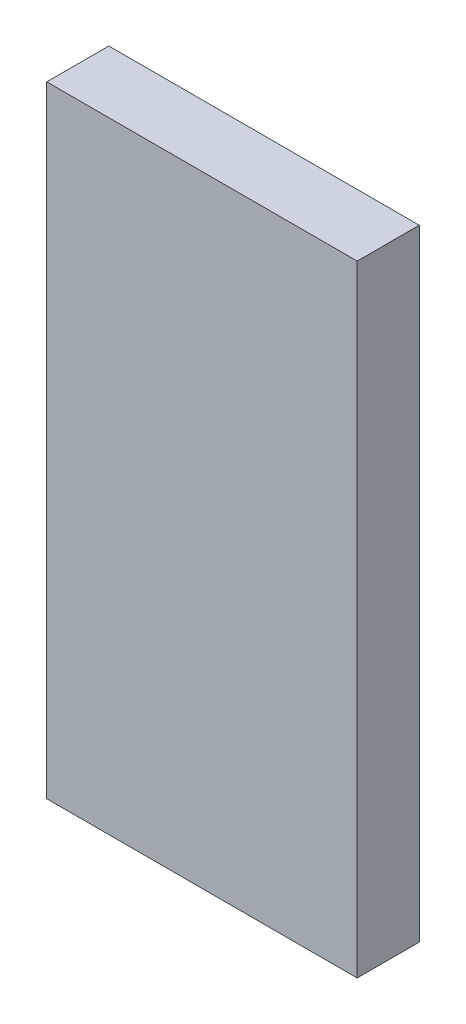
ISO-10303-21;
HEADER;
FILE_DESCRIPTION(('STEP AP214'),'2;1');
FILE_NAME('part.step','',(''),(''),'','','');
FILE_SCHEMA(('AUTOMOTIVE_DESIGN { 1 0 10303 214 1 1 1 1 }'));
ENDSEC;
DATA;
#1=APPLICATION_CONTEXT('core data for automotive mechanical design processes');
#2=APPLICATION_PROTOCOL_DEFINITION('international standard','automotive_design',2000,#1);
#3=PRODUCT_CONTEXT('',#1,'mechanical');
#4=PRODUCT('Part','Part','',(#3));
#5=PRODUCT_RELATED_PRODUCT_CATEGORY('part','',(#4));
#6=PRODUCT_DEFINITION_FORMATION('','',#4);
#7=PRODUCT_DEFINITION_CONTEXT('part definition',#1,'design');
#8=PRODUCT_DEFINITION('design','',#6,#7);
#9=PRODUCT_DEFINITION_SHAPE('','',#8);
#10=(LENGTH_UNIT() NAMED_UNIT(*) SI_UNIT(.MILLI.,.METRE.));
#11=(NAMED_UNIT(*) PLANE_ANGLE_UNIT() SI_UNIT($,.RADIAN.));
#12=(NAMED_UNIT(*) SI_UNIT($,.STERADIAN.) SOLID_ANGLE_UNIT());
#13=UNCERTAINTY_MEASURE_WITH_UNIT(LENGTH_MEASURE(1.E-05),#10,'distance_accuracy_value','');
#14=(GEOMETRIC_REPRESENTATION_CONTEXT(3) GLOBAL_UNCERTAINTY_ASSIGNED_CONTEXT((#13)) GLOBAL_UNIT_ASSIGNED_CONTEXT((#10,
#11,#12)) REPRESENTATION_CONTEXT('',''));
#15=CARTESIAN_POINT('',(0.,0.,0.));
#16=DIRECTION('',(0.,0.,1.));
#17=DIRECTION('',(1.,0.,0.));
#18=AXIS2_PLACEMENT_3D('',#15,#16,#17);
#19=CARTESIAN_POINT('',(0.,0.,0.));
#20=DIRECTION('',(0.,0.,1.));
#21=DIRECTION('',(1.,0.,0.));
#22=AXIS2_PLACEMENT_3D('',#19,#20,#21);
#23=PLANE('',#22);
#24=DIRECTION('',(0.,-1.,0.));
#25=VECTOR('',#24,1.);
#26=CARTESIAN_POINT('',(-103.022771180261,45.3184417448885,0.));
#27=LINE('',#26,#25);
#28=CARTESIAN_POINT('',(-103.022771180261,45.3184417448885,0.));
#29=VERTEX_POINT('',#28);
#30=CARTESIAN_POINT('',(-103.022771180261,-34.6815582551115,0.));
#31=VERTEX_POINT('',#30);
#32=EDGE_CURVE('E278',#29,#31,#27,.T.);
#33=ORIENTED_EDGE('',*,*,#32,.F.);
#34=DIRECTION('',(1.,0.,0.));
#35=VECTOR('',#34,1.);
#36=CARTESIAN_POINT('',(-103.022771180261,45.3184417448885,0.));
#37=LINE('',#36,#35);
#38=CARTESIAN_POINT('',(-63.022771180261,45.3184417448885,0.));
#39=VERTEX_POINT('',#38);
#40=EDGE_CURVE('E284',#29,#39,#37,.T.);
#41=ORIENTED_EDGE('',*,*,#40,.T.);
#42=DIRECTION('',(0.,-1.,0.));
#43=VECTOR('',#42,1.);
#44=CARTESIAN_POINT('',(-63.022771180261,45.3184417448885,0.));
#45=LINE('',#44,#43);
#46=CARTESIAN_POINT('',(-63.022771180261,-34.6815582551115,0.));
#47=VERTEX_POINT('',#46);
#48=EDGE_CURVE('E303',#39,#47,#45,.T.);
#49=ORIENTED_EDGE('',*,*,#48,.T.);
#50=DIRECTION('',(1.,0.,0.));
#51=VECTOR('',#50,1.);
#52=CARTESIAN_POINT('',(-103.022771180261,-34.6815582551115,0.));
#53=LINE('',#52,#51);
#54=EDGE_CURVE('E299',#31,#47,#53,.T.);
#55=ORIENTED_EDGE('',*,*,#54,.F.);
#56=EDGE_LOOP('',(#33,#41,#49,#55));
#57=FACE_BOUND('',#56,.T.);
#58=DIRECTION('',(0.707106781186549,-0.707106781186546,0.));
#59=VECTOR('',#58,1.);
#60=CARTESIAN_POINT('',(-94.8912840094374,34.6824027755674,0.));
#61=LINE('',#60,#59);
#62=CARTESIAN_POINT('',(-94.8912840094374,34.6824027755674,0.));
#63=VERTEX_POINT('',#62);
#64=CARTESIAN_POINT('',(-68.8912840094374,8.68240277556752,0.));
#65=VERTEX_POINT('',#64);
#66=EDGE_CURVE('E186',#63,#65,#61,.T.);
#67=ORIENTED_EDGE('',*,*,#66,.F.);
#68=DIRECTION('',(-0.707106781186546,-0.707106781186549,0.));
#69=VECTOR('',#68,1.);
#70=CARTESIAN_POINT('',(-94.8912840094374,34.6824027755674,0.));
#71=LINE('',#70,#69);
#72=CARTESIAN_POINT('',(-97.012604352997,32.5610824320078,0.));
#73=VERTEX_POINT('',#72);
#74=EDGE_CURVE('E167',#63,#73,#71,.T.);
#75=ORIENTED_EDGE('',*,*,#74,.T.);
#76=DIRECTION('',(0.,-1.,0.));
#77=VECTOR('',#76,1.);
#78=CARTESIAN_POINT('',(-97.012604352997,25.3184417448885,0.));
#79=LINE('',#78,#77);
#80=CARTESIAN_POINT('',(-97.012604352997,-17.6815582551115,0.));
#81=VERTEX_POINT('',#80);
#82=EDGE_CURVE('E252',#73,#81,#79,.T.);
#83=ORIENTED_EDGE('',*,*,#82,.T.);
#84=DIRECTION('',(1.,0.,0.));
#85=VECTOR('',#84,1.);
#86=CARTESIAN_POINT('',(-94.012604352997,-17.6815582551115,0.));
#87=LINE('',#86,#85);
#88=CARTESIAN_POINT('',(-71.012604352997,-17.6815582551115,0.));
#89=VERTEX_POINT('',#88);
#90=EDGE_CURVE('E79',#81,#89,#87,.T.);
#91=ORIENTED_EDGE('',*,*,#90,.T.);
#92=DIRECTION('',(0.,1.,0.));
#93=VECTOR('',#92,1.);
#94=CARTESIAN_POINT('',(-71.012604352997,-14.6815582551115,0.));
#95=LINE('',#94,#93);
#96=CARTESIAN_POINT('',(-71.012604352997,6.56108243200788,0.));
#97=VERTEX_POINT('',#96);
#98=EDGE_CURVE('E262',#89,#97,#95,.T.);
#99=ORIENTED_EDGE('',*,*,#98,.T.);
#100=DIRECTION('',(-0.707106781186546,-0.707106781186549,0.));
#101=VECTOR('',#100,1.);
#102=CARTESIAN_POINT('',(-68.8912840094374,8.68240277556752,0.));
#103=LINE('',#102,#101);
#104=EDGE_CURVE('E179',#65,#97,#103,.T.);
#105=ORIENTED_EDGE('',*,*,#104,.F.);
#106=EDGE_LOOP('',(#67,#75,#83,#91,#99,#105));
#107=FACE_BOUND('',#106,.T.);
#108=ADVANCED_FACE('F63',(#57,#107),#23,.F.);
#109=CARTESIAN_POINT('',(-103.022771180261,45.3184417448885,8.));
#110=DIRECTION('',(1.,0.,0.));
#111=DIRECTION('',(0.,1.,0.));
#112=AXIS2_PLACEMENT_3D('',#109,#110,#111);
#113=PLANE('',#112);
#114=ORIENTED_EDGE('',*,*,#32,.T.);
#115=DIRECTION('',(0.,0.,-1.));
#116=VECTOR('',#115,1.);
#117=CARTESIAN_POINT('',(-103.022771180261,-34.6815582551115,8.));
#118=LINE('',#117,#116);
#119=CARTESIAN_POINT('',(-103.022771180261,-34.6815582551115,8.));
#120=VERTEX_POINT('',#119);
#121=EDGE_CURVE('E12',#120,#31,#118,.T.);
#122=ORIENTED_EDGE('',*,*,#121,.F.);
#123=DIRECTION('',(0.,-1.,0.));
#124=VECTOR('',#123,1.);
#125=CARTESIAN_POINT('',(-103.022771180261,45.3184417448885,8.));
#126=LINE('',#125,#124);
#127=CARTESIAN_POINT('',(-103.022771180261,45.3184417448885,8.));
#128=VERTEX_POINT('',#127);
#129=EDGE_CURVE('E279',#128,#120,#126,.T.);
#130=ORIENTED_EDGE('',*,*,#129,.F.);
#131=DIRECTION('',(0.,0.,-1.));
#132=VECTOR('',#131,1.);
#133=CARTESIAN_POINT('',(-103.022771180261,45.3184417448885,8.));
#134=LINE('',#133,#132);
#135=EDGE_CURVE('E295',#128,#29,#134,.T.);
#136=ORIENTED_EDGE('',*,*,#135,.T.);
#137=EDGE_LOOP('',(#114,#122,#130,#136));
#138=FACE_BOUND('',#137,.T.);
#139=ADVANCED_FACE('F65',(#138),#113,.F.);
#140=CARTESIAN_POINT('',(-103.022771180261,-34.6815582551115,8.));
#141=DIRECTION('',(0.,1.,0.));
#142=DIRECTION('',(-1.,0.,0.));
#143=AXIS2_PLACEMENT_3D('',#140,#141,#142);
#144=PLANE('',#143);
#145=ORIENTED_EDGE('',*,*,#54,.T.);
#146=DIRECTION('',(0.,0.,-1.));
#147=VECTOR('',#146,1.);
#148=CARTESIAN_POINT('',(-63.022771180261,-34.6815582551115,8.));
#149=LINE('',#148,#147);
#150=CARTESIAN_POINT('',(-63.022771180261,-34.6815582551115,8.));
#151=VERTEX_POINT('',#150);
#152=EDGE_CURVE('E72',#151,#47,#149,.T.);
#153=ORIENTED_EDGE('',*,*,#152,.F.);
#154=DIRECTION('',(1.,0.,0.));
#155=VECTOR('',#154,1.);
#156=CARTESIAN_POINT('',(-103.022771180261,-34.6815582551115,8.));
#157=LINE('',#156,#155);
#158=EDGE_CURVE('E283',#120,#151,#157,.T.);
#159=ORIENTED_EDGE('',*,*,#158,.F.);
#160=ORIENTED_EDGE('',*,*,#121,.T.);
#161=EDGE_LOOP('',(#145,#153,#159,#160));
#162=FACE_BOUND('',#161,.T.);
#163=ADVANCED_FACE('F321',(#162),#144,.F.);
#164=CARTESIAN_POINT('',(-63.022771180261,45.3184417448885,8.));
#165=DIRECTION('',(1.,0.,0.));
#166=DIRECTION('',(0.,1.,0.));
#167=AXIS2_PLACEMENT_3D('',#164,#165,#166);
#168=PLANE('',#167);
#169=ORIENTED_EDGE('',*,*,#48,.F.);
#170=DIRECTION('',(0.,0.,-1.));
#171=VECTOR('',#170,1.);
#172=CARTESIAN_POINT('',(-63.022771180261,45.3184417448885,8.));
#173=LINE('',#172,#171);
#174=CARTESIAN_POINT('',(-63.022771180261,45.3184417448885,8.));
#175=VERTEX_POINT('',#174);
#176=EDGE_CURVE('E312',#175,#39,#173,.T.);
#177=ORIENTED_EDGE('',*,*,#176,.F.);
#178=DIRECTION('',(0.,-1.,0.));
#179=VECTOR('',#178,1.);
#180=CARTESIAN_POINT('',(-63.022771180261,45.3184417448885,8.));
#181=LINE('',#180,#179);
#182=EDGE_CURVE('E287',#175,#151,#181,.T.);
#183=ORIENTED_EDGE('',*,*,#182,.T.);
#184=ORIENTED_EDGE('',*,*,#152,.T.);
#185=EDGE_LOOP('',(#169,#177,#183,#184));
#186=FACE_BOUND('',#185,.T.);
#187=ADVANCED_FACE('F318',(#186),#168,.T.);
#188=CARTESIAN_POINT('',(-103.022771180261,45.3184417448885,8.));
#189=DIRECTION('',(0.,1.,0.));
#190=DIRECTION('',(0.,0.,1.));
#191=AXIS2_PLACEMENT_3D('',#188,#189,#190);
#192=PLANE('',#191);
#193=ORIENTED_EDGE('',*,*,#40,.F.);
#194=ORIENTED_EDGE('',*,*,#135,.F.);
#195=DIRECTION('',(1.,0.,0.));
#196=VECTOR('',#195,1.);
#197=CARTESIAN_POINT('',(-103.022771180261,45.3184417448885,8.));
#198=LINE('',#197,#196);
#199=EDGE_CURVE('E291',#128,#175,#198,.T.);
#200=ORIENTED_EDGE('',*,*,#199,.T.);
#201=ORIENTED_EDGE('',*,*,#176,.T.);
#202=EDGE_LOOP('',(#193,#194,#200,#201));
#203=FACE_BOUND('',#202,.T.);
#204=ADVANCED_FACE('F327',(#203),#192,.T.);
#205=CARTESIAN_POINT('',(0.,0.,8.));
#206=DIRECTION('',(0.,0.,1.));
#207=DIRECTION('',(1.,0.,0.));
#208=AXIS2_PLACEMENT_3D('',#205,#206,#207);
#209=PLANE('',#208);
#210=ORIENTED_EDGE('',*,*,#129,.T.);
#211=ORIENTED_EDGE('',*,*,#158,.T.);
#212=ORIENTED_EDGE('',*,*,#182,.F.);
#213=ORIENTED_EDGE('',*,*,#199,.F.);
#214=EDGE_LOOP('',(#210,#211,#212,#213));
#215=FACE_BOUND('',#214,.T.);
#216=ADVANCED_FACE('F331',(#215),#209,.T.);
#217=CARTESIAN_POINT('',(0.,0.,6.));
#218=DIRECTION('',(0.,0.,1.));
#219=DIRECTION('',(1.,0.,0.));
#220=AXIS2_PLACEMENT_3D('',#217,#218,#219);
#221=PLANE('',#220);
#222=DIRECTION('',(1.,0.,0.));
#223=VECTOR('',#222,1.);
#224=CARTESIAN_POINT('',(-94.012604352997,-17.6815582551115,6.));
#225=LINE('',#224,#223);
#226=CARTESIAN_POINT('',(-97.012604352997,-17.6815582551115,6.));
#227=VERTEX_POINT('',#226);
#228=CARTESIAN_POINT('',(-71.012604352997,-17.6815582551115,6.));
#229=VERTEX_POINT('',#228);
#230=EDGE_CURVE('E247',#227,#229,#225,.T.);
#231=ORIENTED_EDGE('',*,*,#230,.F.);
#232=DIRECTION('',(0.,-1.,0.));
#233=VECTOR('',#232,1.);
#234=CARTESIAN_POINT('',(-97.012604352997,25.3184417448885,6.));
#235=LINE('',#234,#233);
#236=CARTESIAN_POINT('',(-97.012604352997,32.5610824320078,6.));
#237=VERTEX_POINT('',#236);
#238=EDGE_CURVE('E256',#237,#227,#235,.T.);
#239=ORIENTED_EDGE('',*,*,#238,.F.);
#240=DIRECTION('',(-0.707106781186546,-0.707106781186549,0.));
#241=VECTOR('',#240,1.);
#242=CARTESIAN_POINT('',(-94.8912840094374,34.6824027755674,6.));
#243=LINE('',#242,#241);
#244=CARTESIAN_POINT('',(-94.8912840094374,34.6824027755674,6.));
#245=VERTEX_POINT('',#244);
#246=EDGE_CURVE('E200',#245,#237,#243,.T.);
#247=ORIENTED_EDGE('',*,*,#246,.F.);
#248=DIRECTION('',(-0.707106781186549,0.707106781186546,0.));
#249=VECTOR('',#248,1.);
#250=CARTESIAN_POINT('',(-68.8912840094374,8.68240277556752,6.));
#251=LINE('',#250,#249);
#252=CARTESIAN_POINT('',(-68.8912840094374,8.68240277556752,6.));
#253=VERTEX_POINT('',#252);
#254=EDGE_CURVE('E180',#253,#245,#251,.T.);
#255=ORIENTED_EDGE('',*,*,#254,.F.);
#256=DIRECTION('',(-0.707106781186546,-0.707106781186549,0.));
#257=VECTOR('',#256,1.);
#258=CARTESIAN_POINT('',(-68.8912840094374,8.68240277556752,6.));
#259=LINE('',#258,#257);
#260=CARTESIAN_POINT('',(-71.012604352997,6.56108243200788,6.));
#261=VERTEX_POINT('',#260);
#262=EDGE_CURVE('E204',#253,#261,#259,.T.);
#263=ORIENTED_EDGE('',*,*,#262,.T.);
#264=DIRECTION('',(0.,1.,0.));
#265=VECTOR('',#264,1.);
#266=CARTESIAN_POINT('',(-71.012604352997,-14.6815582551115,6.));
#267=LINE('',#266,#265);
#268=EDGE_CURVE('E251',#229,#261,#267,.T.);
#269=ORIENTED_EDGE('',*,*,#268,.F.);
#270=EDGE_LOOP('',(#231,#239,#247,#255,#263,#269));
#271=FACE_BOUND('',#270,.T.);
#272=DIRECTION('',(0.,1.,0.));
#273=VECTOR('',#272,1.);
#274=CARTESIAN_POINT('',(-77.012604352997,-14.6815582551115,6.));
#275=LINE('',#274,#273);
#276=CARTESIAN_POINT('',(-77.012604352997,-11.6815582551115,6.));
#277=VERTEX_POINT('',#276);
#278=CARTESIAN_POINT('',(-77.012604352997,4.07580105776931,6.));
#279=VERTEX_POINT('',#278);
#280=EDGE_CURVE('E212',#277,#279,#275,.T.);
#281=ORIENTED_EDGE('',*,*,#280,.T.);
#282=DIRECTION('',(-0.707106781186549,0.707106781186546,0.));
#283=VECTOR('',#282,1.);
#284=CARTESIAN_POINT('',(-76.1339246965566,3.19712140132895,6.));
#285=LINE('',#284,#283);
#286=CARTESIAN_POINT('',(-91.012604352997,18.0758010577692,6.));
#287=VERTEX_POINT('',#286);
#288=EDGE_CURVE('E216',#279,#287,#285,.T.);
#289=ORIENTED_EDGE('',*,*,#288,.T.);
#290=DIRECTION('',(0.,-1.,0.));
#291=VECTOR('',#290,1.);
#292=CARTESIAN_POINT('',(-91.012604352997,25.3184417448885,6.));
#293=LINE('',#292,#291);
#294=CARTESIAN_POINT('',(-91.012604352997,-11.6815582551115,6.));
#295=VERTEX_POINT('',#294);
#296=EDGE_CURVE('E220',#287,#295,#293,.T.);
#297=ORIENTED_EDGE('',*,*,#296,.T.);
#298=DIRECTION('',(1.,0.,0.));
#299=VECTOR('',#298,1.);
#300=CARTESIAN_POINT('',(-94.012604352997,-11.6815582551115,6.));
#301=LINE('',#300,#299);
#302=EDGE_CURVE('E209',#295,#277,#301,.T.);
#303=ORIENTED_EDGE('',*,*,#302,.T.);
#304=EDGE_LOOP('',(#281,#289,#297,#303));
#305=FACE_BOUND('',#304,.T.);
#306=ADVANCED_FACE('F371',(#271,#305),#221,.F.);
#307=CARTESIAN_POINT('',(-94.012604352997,-17.6815582551115,6.));
#308=DIRECTION('',(0.,1.,0.));
#309=DIRECTION('',(0.,0.,1.));
#310=AXIS2_PLACEMENT_3D('',#307,#308,#309);
#311=PLANE('',#310);
#312=ORIENTED_EDGE('',*,*,#90,.F.);
#313=DIRECTION('',(0.,0.,-1.));
#314=VECTOR('',#313,1.);
#315=CARTESIAN_POINT('',(-97.012604352997,-17.6815582551115,6.));
#316=LINE('',#315,#314);
#317=EDGE_CURVE('E259',#227,#81,#316,.T.);
#318=ORIENTED_EDGE('',*,*,#317,.F.);
#319=ORIENTED_EDGE('',*,*,#230,.T.);
#320=DIRECTION('',(0.,0.,-1.));
#321=VECTOR('',#320,1.);
#322=CARTESIAN_POINT('',(-71.012604352997,-17.6815582551115,6.));
#323=LINE('',#322,#321);
#324=EDGE_CURVE('E275',#229,#89,#323,.T.);
#325=ORIENTED_EDGE('',*,*,#324,.T.);
#326=EDGE_LOOP('',(#312,#318,#319,#325));
#327=FACE_BOUND('',#326,.T.);
#328=ADVANCED_FACE('F373',(#327),#311,.T.);
#329=CARTESIAN_POINT('',(-71.012604352997,-14.6815582551115,6.));
#330=DIRECTION('',(-1.,0.,0.));
#331=DIRECTION('',(0.,0.,1.));
#332=AXIS2_PLACEMENT_3D('',#329,#330,#331);
#333=PLANE('',#332);
#334=ORIENTED_EDGE('',*,*,#98,.F.);
#335=ORIENTED_EDGE('',*,*,#324,.F.);
#336=ORIENTED_EDGE('',*,*,#268,.T.);
#337=DIRECTION('',(0.,0.,-1.));
#338=VECTOR('',#337,1.);
#339=CARTESIAN_POINT('',(-71.012604352997,6.56108243200788,6.));
#340=LINE('',#339,#338);
#341=EDGE_CURVE('E271',#261,#97,#340,.T.);
#342=ORIENTED_EDGE('',*,*,#341,.T.);
#343=EDGE_LOOP('',(#334,#335,#336,#342));
#344=FACE_BOUND('',#343,.T.);
#345=ADVANCED_FACE('F380',(#344),#333,.T.);
#346=CARTESIAN_POINT('',(-97.012604352997,25.3184417448885,6.));
#347=DIRECTION('',(1.,0.,0.));
#348=DIRECTION('',(0.,0.,-1.));
#349=AXIS2_PLACEMENT_3D('',#346,#347,#348);
#350=PLANE('',#349);
#351=ORIENTED_EDGE('',*,*,#82,.F.);
#352=DIRECTION('',(0.,0.,-1.));
#353=VECTOR('',#352,1.);
#354=CARTESIAN_POINT('',(-97.012604352997,32.5610824320078,6.));
#355=LINE('',#354,#353);
#356=EDGE_CURVE('E173',#237,#73,#355,.T.);
#357=ORIENTED_EDGE('',*,*,#356,.F.);
#358=ORIENTED_EDGE('',*,*,#238,.T.);
#359=ORIENTED_EDGE('',*,*,#317,.T.);
#360=EDGE_LOOP('',(#351,#357,#358,#359));
#361=FACE_BOUND('',#360,.T.);
#362=ADVANCED_FACE('F386',(#361),#350,.T.);
#363=CARTESIAN_POINT('',(-94.012604352997,-11.6815582551115,6.));
#364=DIRECTION('',(0.,1.,0.));
#365=DIRECTION('',(0.,0.,1.));
#366=AXIS2_PLACEMENT_3D('',#363,#364,#365);
#367=PLANE('',#366);
#368=DIRECTION('',(1.,0.,0.));
#369=VECTOR('',#368,1.);
#370=CARTESIAN_POINT('',(-94.012604352997,-11.6815582551115,0.));
#371=LINE('',#370,#369);
#372=CARTESIAN_POINT('',(-91.012604352997,-11.6815582551115,0.));
#373=VERTEX_POINT('',#372);
#374=CARTESIAN_POINT('',(-77.012604352997,-11.6815582551115,0.));
#375=VERTEX_POINT('',#374);
#376=EDGE_CURVE('E203',#373,#375,#371,.T.);
#377=ORIENTED_EDGE('',*,*,#376,.T.);
#378=DIRECTION('',(0.,0.,-1.));
#379=VECTOR('',#378,1.);
#380=CARTESIAN_POINT('',(-77.012604352997,-11.6815582551115,6.));
#381=LINE('',#380,#379);
#382=EDGE_CURVE('E244',#277,#375,#381,.T.);
#383=ORIENTED_EDGE('',*,*,#382,.F.);
#384=ORIENTED_EDGE('',*,*,#302,.F.);
#385=DIRECTION('',(0.,0.,-1.));
#386=VECTOR('',#385,1.);
#387=CARTESIAN_POINT('',(-91.012604352997,-11.6815582551115,6.));
#388=LINE('',#387,#386);
#389=EDGE_CURVE('E223',#295,#373,#388,.T.);
#390=ORIENTED_EDGE('',*,*,#389,.T.);
#391=EDGE_LOOP('',(#377,#383,#384,#390));
#392=FACE_BOUND('',#391,.T.);
#393=ADVANCED_FACE('F367',(#392),#367,.F.);
#394=CARTESIAN_POINT('',(-77.012604352997,-14.6815582551115,6.));
#395=DIRECTION('',(-1.,0.,0.));
#396=DIRECTION('',(0.,0.,1.));
#397=AXIS2_PLACEMENT_3D('',#394,#395,#396);
#398=PLANE('',#397);
#399=DIRECTION('',(0.,1.,0.));
#400=VECTOR('',#399,1.);
#401=CARTESIAN_POINT('',(-77.012604352997,-14.6815582551115,0.));
#402=LINE('',#401,#400);
#403=CARTESIAN_POINT('',(-77.012604352997,4.07580105776931,0.));
#404=VERTEX_POINT('',#403);
#405=EDGE_CURVE('E227',#375,#404,#402,.T.);
#406=ORIENTED_EDGE('',*,*,#405,.T.);
#407=DIRECTION('',(0.,0.,-1.));
#408=VECTOR('',#407,1.);
#409=CARTESIAN_POINT('',(-77.012604352997,4.07580105776931,6.));
#410=LINE('',#409,#408);
#411=EDGE_CURVE('E241',#279,#404,#410,.T.);
#412=ORIENTED_EDGE('',*,*,#411,.F.);
#413=ORIENTED_EDGE('',*,*,#280,.F.);
#414=ORIENTED_EDGE('',*,*,#382,.T.);
#415=EDGE_LOOP('',(#406,#412,#413,#414));
#416=FACE_BOUND('',#415,.T.);
#417=ADVANCED_FACE('F361',(#416),#398,.F.);
#418=CARTESIAN_POINT('',(-76.1339246965566,3.19712140132895,6.));
#419=DIRECTION('',(-0.707106781186546,-0.707106781186549,0.));
#420=DIRECTION('',(0.707106781186549,-0.707106781186546,0.));
#421=AXIS2_PLACEMENT_3D('',#418,#419,#420);
#422=PLANE('',#421);
#423=DIRECTION('',(-0.707106781186549,0.707106781186546,0.));
#424=VECTOR('',#423,1.);
#425=CARTESIAN_POINT('',(-76.1339246965566,3.19712140132895,0.));
#426=LINE('',#425,#424);
#427=CARTESIAN_POINT('',(-91.012604352997,18.0758010577692,0.));
#428=VERTEX_POINT('',#427);
#429=EDGE_CURVE('E87',#404,#428,#426,.T.);
#430=ORIENTED_EDGE('',*,*,#429,.T.);
#431=DIRECTION('',(0.,0.,-1.));
#432=VECTOR('',#431,1.);
#433=CARTESIAN_POINT('',(-91.012604352997,18.0758010577692,6.));
#434=LINE('',#433,#432);
#435=EDGE_CURVE('E238',#287,#428,#434,.T.);
#436=ORIENTED_EDGE('',*,*,#435,.F.);
#437=ORIENTED_EDGE('',*,*,#288,.F.);
#438=ORIENTED_EDGE('',*,*,#411,.T.);
#439=EDGE_LOOP('',(#430,#436,#437,#438));
#440=FACE_BOUND('',#439,.T.);
#441=ADVANCED_FACE('F353',(#440),#422,.F.);
#442=CARTESIAN_POINT('',(-91.012604352997,25.3184417448885,6.));
#443=DIRECTION('',(1.,0.,0.));
#444=DIRECTION('',(0.,0.,-1.));
#445=AXIS2_PLACEMENT_3D('',#442,#443,#444);
#446=PLANE('',#445);
#447=DIRECTION('',(0.,-1.,0.));
#448=VECTOR('',#447,1.);
#449=CARTESIAN_POINT('',(-91.012604352997,25.3184417448885,0.));
#450=LINE('',#449,#448);
#451=EDGE_CURVE('E213',#428,#373,#450,.T.);
#452=ORIENTED_EDGE('',*,*,#451,.T.);
#453=ORIENTED_EDGE('',*,*,#389,.F.);
#454=ORIENTED_EDGE('',*,*,#296,.F.);
#455=ORIENTED_EDGE('',*,*,#435,.T.);
#456=EDGE_LOOP('',(#452,#453,#454,#455));
#457=FACE_BOUND('',#456,.T.);
#458=ADVANCED_FACE('F345',(#457),#446,.F.);
#459=ORIENTED_EDGE('',*,*,#405,.F.);
#460=ORIENTED_EDGE('',*,*,#376,.F.);
#461=ORIENTED_EDGE('',*,*,#451,.F.);
#462=ORIENTED_EDGE('',*,*,#429,.F.);
#463=EDGE_LOOP('',(#459,#460,#461,#462));
#464=FACE_BOUND('',#463,.T.);
#465=ADVANCED_FACE('F339',(#464),#23,.F.);
#466=CARTESIAN_POINT('',(-94.8912840094374,34.6824027755674,6.));
#467=DIRECTION('',(-0.707106781186549,0.707106781186546,0.));
#468=DIRECTION('',(-0.707106781186546,-0.707106781186549,0.));
#469=AXIS2_PLACEMENT_3D('',#466,#467,#468);
#470=PLANE('',#469);
#471=ORIENTED_EDGE('',*,*,#356,.T.);
#472=ORIENTED_EDGE('',*,*,#74,.F.);
#473=DIRECTION('',(0.,0.,-1.));
#474=VECTOR('',#473,1.);
#475=CARTESIAN_POINT('',(-94.8912840094374,34.6824027755674,6.));
#476=LINE('',#475,#474);
#477=EDGE_CURVE('E170',#245,#63,#476,.T.);
#478=ORIENTED_EDGE('',*,*,#477,.F.);
#479=ORIENTED_EDGE('',*,*,#246,.T.);
#480=EDGE_LOOP('',(#471,#472,#478,#479));
#481=FACE_BOUND('',#480,.T.);
#482=ADVANCED_FACE('F169',(#481),#470,.F.);
#483=CARTESIAN_POINT('',(-68.8912840094374,8.68240277556752,0.));
#484=DIRECTION('',(0.707106781186549,-0.707106781186546,0.));
#485=DIRECTION('',(0.707106781186546,0.707106781186549,0.));
#486=AXIS2_PLACEMENT_3D('',#483,#484,#485);
#487=PLANE('',#486);
#488=ORIENTED_EDGE('',*,*,#341,.F.);
#489=ORIENTED_EDGE('',*,*,#262,.F.);
#490=DIRECTION('',(0.,0.,1.));
#491=VECTOR('',#490,1.);
#492=CARTESIAN_POINT('',(-68.8912840094374,8.68240277556752,0.));
#493=LINE('',#492,#491);
#494=EDGE_CURVE('E193',#65,#253,#493,.T.);
#495=ORIENTED_EDGE('',*,*,#494,.F.);
#496=ORIENTED_EDGE('',*,*,#104,.T.);
#497=EDGE_LOOP('',(#488,#489,#495,#496));
#498=FACE_BOUND('',#497,.T.);
#499=ADVANCED_FACE('F351',(#498),#487,.F.);
#500=CARTESIAN_POINT('',(-30.1044406169348,-30.1044406169349,0.));
#501=DIRECTION('',(-0.707106781186546,-0.707106781186549,0.));
#502=DIRECTION('',(0.707106781186549,-0.707106781186546,0.));
#503=AXIS2_PLACEMENT_3D('',#500,#501,#502);
#504=PLANE('',#503);
#505=ORIENTED_EDGE('',*,*,#477,.T.);
#506=ORIENTED_EDGE('',*,*,#66,.T.);
#507=ORIENTED_EDGE('',*,*,#494,.T.);
#508=ORIENTED_EDGE('',*,*,#254,.T.);
#509=EDGE_LOOP('',(#505,#506,#507,#508));
#510=FACE_BOUND('',#509,.T.);
#511=ADVANCED_FACE('F184',(#510),#504,.T.);
#512=CLOSED_SHELL('',(#108,#139,#163,#187,#204,#216,#306,#328,#345,#362,#393,#417,#441,#458,
#465,#482,#499,#511));
#513=MANIFOLD_SOLID_BREP('B2',#512);
#514=ADVANCED_BREP_SHAPE_REPRESENTATION('',(#18,#513),#14);
#515=SHAPE_DEFINITION_REPRESENTATION(#9,#514);
ENDSEC;
END-ISO-10303-21;
